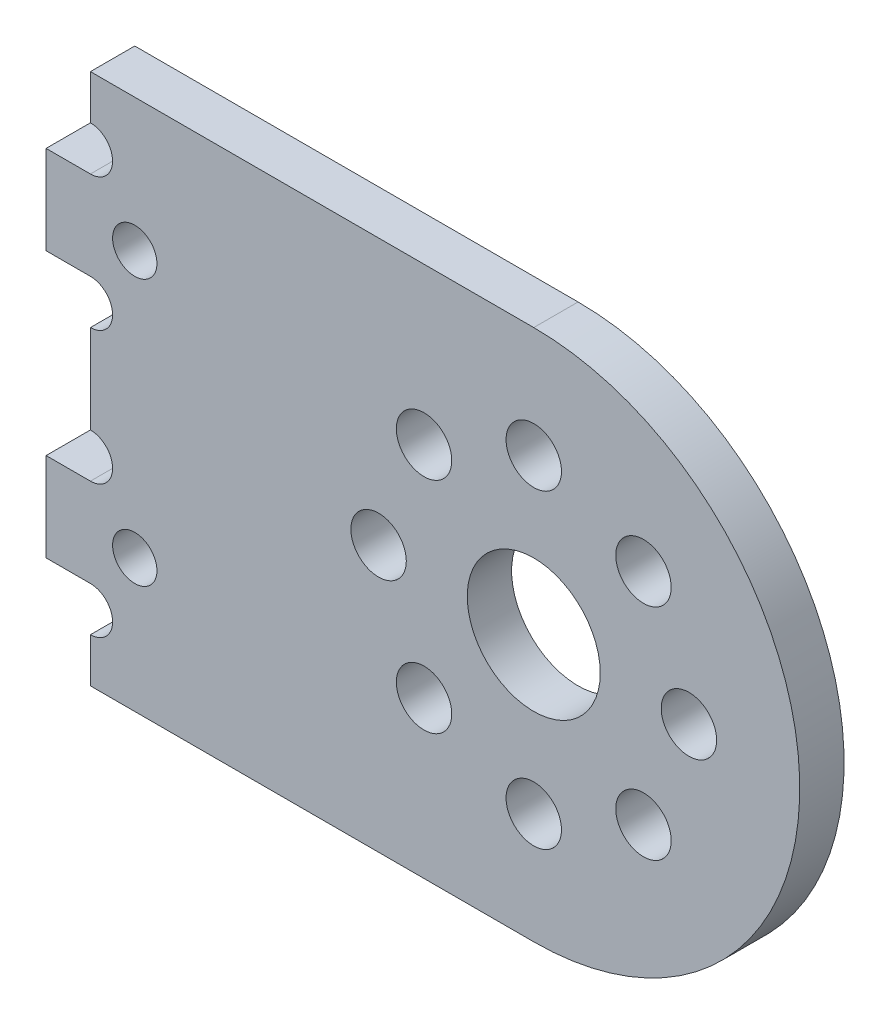
ISO-10303-21;
HEADER;
FILE_DESCRIPTION(('STEP AP214'),'2;1');
FILE_NAME('part.step','',(''),(''),'','','');
FILE_SCHEMA(('AUTOMOTIVE_DESIGN { 1 0 10303 214 1 1 1 1 }'));
ENDSEC;
DATA;
#1=APPLICATION_CONTEXT('core data for automotive mechanical design processes');
#2=APPLICATION_PROTOCOL_DEFINITION('international standard','automotive_design',2000,#1);
#3=PRODUCT_CONTEXT('',#1,'mechanical');
#4=PRODUCT('Part','Part','',(#3));
#5=PRODUCT_RELATED_PRODUCT_CATEGORY('part','',(#4));
#6=PRODUCT_DEFINITION_FORMATION('','',#4);
#7=PRODUCT_DEFINITION_CONTEXT('part definition',#1,'design');
#8=PRODUCT_DEFINITION('design','',#6,#7);
#9=PRODUCT_DEFINITION_SHAPE('','',#8);
#10=(LENGTH_UNIT() NAMED_UNIT(*) SI_UNIT(.MILLI.,.METRE.));
#11=(NAMED_UNIT(*) PLANE_ANGLE_UNIT() SI_UNIT($,.RADIAN.));
#12=(NAMED_UNIT(*) SI_UNIT($,.STERADIAN.) SOLID_ANGLE_UNIT());
#13=UNCERTAINTY_MEASURE_WITH_UNIT(LENGTH_MEASURE(1.E-05),#10,'distance_accuracy_value','');
#14=(GEOMETRIC_REPRESENTATION_CONTEXT(3) GLOBAL_UNCERTAINTY_ASSIGNED_CONTEXT((#13)) GLOBAL_UNIT_ASSIGNED_CONTEXT((#10,
#11,#12)) REPRESENTATION_CONTEXT('',''));
#15=CARTESIAN_POINT('',(0.,0.,0.));
#16=DIRECTION('',(0.,0.,1.));
#17=DIRECTION('',(1.,0.,0.));
#18=AXIS2_PLACEMENT_3D('',#15,#16,#17);
#19=CARTESIAN_POINT('',(-3.40478597967663,-0.138647311224838,2.));
#20=DIRECTION('',(0.,0.,-1.));
#21=DIRECTION('',(-1.,0.,0.));
#22=AXIS2_PLACEMENT_3D('',#19,#20,#21);
#23=PLANE('',#22);
#24=DIRECTION('',(-1.,0.,0.));
#25=VECTOR('',#24,1.);
#26=CARTESIAN_POINT('',(-23.4047859796766,11.8613526887752,2.));
#27=LINE('',#26,#25);
#28=CARTESIAN_POINT('',(-3.40478597967663,11.8613526887752,2.));
#29=VERTEX_POINT('',#28);
#30=CARTESIAN_POINT('',(-23.4047859796766,11.8613526887752,2.));
#31=VERTEX_POINT('',#30);
#32=EDGE_CURVE('E209',#29,#31,#27,.T.);
#33=ORIENTED_EDGE('',*,*,#32,.T.);
#34=DIRECTION('',(0.,-1.,0.));
#35=VECTOR('',#34,1.);
#36=CARTESIAN_POINT('',(-23.4047859796766,11.8613526887752,2.));
#37=LINE('',#36,#35);
#38=CARTESIAN_POINT('',(-23.4047859796766,9.86135268877516,2.));
#39=VERTEX_POINT('',#38);
#40=EDGE_CURVE('E117',#31,#39,#37,.T.);
#41=ORIENTED_EDGE('',*,*,#40,.T.);
#42=CARTESIAN_POINT('',(-23.4047859796766,8.86135268877516,2.));
#43=DIRECTION('',(0.,0.,-1.));
#44=DIRECTION('',(1.,0.,0.));
#45=AXIS2_PLACEMENT_3D('',#42,#43,#44);
#46=CIRCLE('',#45,1.);
#47=CARTESIAN_POINT('',(-23.4047859796766,7.86135268877516,2.));
#48=VERTEX_POINT('',#47);
#49=EDGE_CURVE('E248',#39,#48,#46,.T.);
#50=ORIENTED_EDGE('',*,*,#49,.T.);
#51=DIRECTION('',(-1.,0.,0.));
#52=VECTOR('',#51,1.);
#53=CARTESIAN_POINT('',(-23.4047859796766,7.86135268877516,2.));
#54=LINE('',#53,#52);
#55=CARTESIAN_POINT('',(-25.4047859796766,7.86135268877516,2.));
#56=VERTEX_POINT('',#55);
#57=EDGE_CURVE('E267',#48,#56,#54,.T.);
#58=ORIENTED_EDGE('',*,*,#57,.T.);
#59=DIRECTION('',(0.,-1.,0.));
#60=VECTOR('',#59,1.);
#61=CARTESIAN_POINT('',(-25.4047859796766,7.86135268877516,2.));
#62=LINE('',#61,#60);
#63=CARTESIAN_POINT('',(-25.4047859796766,3.86135268877516,2.));
#64=VERTEX_POINT('',#63);
#65=EDGE_CURVE('E264',#56,#64,#62,.T.);
#66=ORIENTED_EDGE('',*,*,#65,.T.);
#67=DIRECTION('',(1.,0.,0.));
#68=VECTOR('',#67,1.);
#69=CARTESIAN_POINT('',(-23.4047859796766,3.86135268877516,2.));
#70=LINE('',#69,#68);
#71=CARTESIAN_POINT('',(-23.4047859796766,3.86135268877516,2.));
#72=VERTEX_POINT('',#71);
#73=EDGE_CURVE('E266',#64,#72,#70,.T.);
#74=ORIENTED_EDGE('',*,*,#73,.T.);
#75=CARTESIAN_POINT('',(-23.4047859796766,2.86135268877516,2.));
#76=DIRECTION('',(0.,0.,-1.));
#77=DIRECTION('',(-1.,0.,0.));
#78=AXIS2_PLACEMENT_3D('',#75,#76,#77);
#79=CIRCLE('',#78,1.);
#80=CARTESIAN_POINT('',(-23.4047859796766,1.86135268877516,2.));
#81=VERTEX_POINT('',#80);
#82=EDGE_CURVE('E269',#72,#81,#79,.T.);
#83=ORIENTED_EDGE('',*,*,#82,.T.);
#84=DIRECTION('',(0.,-1.,0.));
#85=VECTOR('',#84,1.);
#86=CARTESIAN_POINT('',(-23.4047859796766,1.86135268877516,2.));
#87=LINE('',#86,#85);
#88=CARTESIAN_POINT('',(-23.4047859796766,-2.13864731122484,2.));
#89=VERTEX_POINT('',#88);
#90=EDGE_CURVE('E275',#81,#89,#87,.T.);
#91=ORIENTED_EDGE('',*,*,#90,.T.);
#92=CARTESIAN_POINT('',(-23.4047859796766,-3.13864731122484,2.));
#93=DIRECTION('',(0.,0.,-1.));
#94=DIRECTION('',(1.,0.,0.));
#95=AXIS2_PLACEMENT_3D('',#92,#93,#94);
#96=CIRCLE('',#95,1.);
#97=CARTESIAN_POINT('',(-23.4047859796766,-4.13864731122484,2.));
#98=VERTEX_POINT('',#97);
#99=EDGE_CURVE('E277',#89,#98,#96,.T.);
#100=ORIENTED_EDGE('',*,*,#99,.T.);
#101=DIRECTION('',(-1.,0.,0.));
#102=VECTOR('',#101,1.);
#103=CARTESIAN_POINT('',(-23.4047859796766,-4.13864731122484,2.));
#104=LINE('',#103,#102);
#105=CARTESIAN_POINT('',(-25.4047859796766,-4.13864731122484,2.));
#106=VERTEX_POINT('',#105);
#107=EDGE_CURVE('E279',#98,#106,#104,.T.);
#108=ORIENTED_EDGE('',*,*,#107,.T.);
#109=DIRECTION('',(0.,-1.,0.));
#110=VECTOR('',#109,1.);
#111=CARTESIAN_POINT('',(-25.4047859796766,-4.13864731122484,2.));
#112=LINE('',#111,#110);
#113=CARTESIAN_POINT('',(-25.4047859796766,-8.13864731122484,2.));
#114=VERTEX_POINT('',#113);
#115=EDGE_CURVE('E281',#106,#114,#112,.T.);
#116=ORIENTED_EDGE('',*,*,#115,.T.);
#117=DIRECTION('',(1.,0.,0.));
#118=VECTOR('',#117,1.);
#119=CARTESIAN_POINT('',(-23.4047859796766,-8.13864731122484,2.));
#120=LINE('',#119,#118);
#121=CARTESIAN_POINT('',(-23.4047859796766,-8.13864731122484,2.));
#122=VERTEX_POINT('',#121);
#123=EDGE_CURVE('E283',#114,#122,#120,.T.);
#124=ORIENTED_EDGE('',*,*,#123,.T.);
#125=CARTESIAN_POINT('',(-23.4047859796766,-9.13864731122484,2.));
#126=DIRECTION('',(0.,0.,-1.));
#127=DIRECTION('',(-1.,0.,0.));
#128=AXIS2_PLACEMENT_3D('',#125,#126,#127);
#129=CIRCLE('',#128,1.);
#130=CARTESIAN_POINT('',(-23.4047859796766,-10.1386473112248,2.));
#131=VERTEX_POINT('',#130);
#132=EDGE_CURVE('E160',#122,#131,#129,.T.);
#133=ORIENTED_EDGE('',*,*,#132,.T.);
#134=DIRECTION('',(0.,-1.,0.));
#135=VECTOR('',#134,1.);
#136=CARTESIAN_POINT('',(-23.4047859796766,-10.1386473112248,2.));
#137=LINE('',#136,#135);
#138=CARTESIAN_POINT('',(-23.4047859796766,-12.1386473112248,2.));
#139=VERTEX_POINT('',#138);
#140=EDGE_CURVE('E154',#131,#139,#137,.T.);
#141=ORIENTED_EDGE('',*,*,#140,.T.);
#142=DIRECTION('',(1.,0.,0.));
#143=VECTOR('',#142,1.);
#144=CARTESIAN_POINT('',(-3.40478597967662,-12.1386473112248,2.));
#145=LINE('',#144,#143);
#146=CARTESIAN_POINT('',(-3.40478597967662,-12.1386473112248,2.));
#147=VERTEX_POINT('',#146);
#148=EDGE_CURVE('E158',#139,#147,#145,.T.);
#149=ORIENTED_EDGE('',*,*,#148,.T.);
#150=CARTESIAN_POINT('',(-3.40478597967663,-0.138647311224838,2.));
#151=DIRECTION('',(0.,0.,1.));
#152=DIRECTION('',(-1.,0.,0.));
#153=AXIS2_PLACEMENT_3D('',#150,#151,#152);
#154=CIRCLE('',#153,12.);
#155=EDGE_CURVE('E50',#147,#29,#154,.T.);
#156=ORIENTED_EDGE('',*,*,#155,.T.);
#157=EDGE_LOOP('',(#33,#41,#50,#58,#66,#74,#83,#91,#100,#108,#116,#124,#133,#141,#149,#156));
#158=FACE_BOUND('',#157,.T.);
#159=CARTESIAN_POINT('',(-3.40478597967662,6.86135268877516,2.));
#160=DIRECTION('',(0.,0.,1.));
#161=DIRECTION('',(1.,0.,0.));
#162=AXIS2_PLACEMENT_3D('',#159,#160,#161);
#163=CIRCLE('',#162,1.25);
#164=CARTESIAN_POINT('',(-2.15478597967662,6.86135268877516,2.));
#165=VERTEX_POINT('',#164);
#166=EDGE_CURVE('E182',#165,#165,#163,.T.);
#167=ORIENTED_EDGE('',*,*,#166,.F.);
#168=EDGE_LOOP('',(#167));
#169=FACE_BOUND('',#168,.T.);
#170=CARTESIAN_POINT('',(1.54496148862924,4.81110015708106,2.));
#171=DIRECTION('',(0.,0.,1.));
#172=DIRECTION('',(1.,0.,0.));
#173=AXIS2_PLACEMENT_3D('',#170,#171,#172);
#174=CIRCLE('',#173,1.25);
#175=CARTESIAN_POINT('',(2.79496148862924,4.81110015708106,2.));
#176=VERTEX_POINT('',#175);
#177=EDGE_CURVE('E417',#176,#176,#174,.T.);
#178=ORIENTED_EDGE('',*,*,#177,.F.);
#179=EDGE_LOOP('',(#178));
#180=FACE_BOUND('',#179,.T.);
#181=CARTESIAN_POINT('',(-3.40478597967662,-0.13864731122484,2.));
#182=DIRECTION('',(0.,0.,1.));
#183=DIRECTION('',(1.,0.,0.));
#184=AXIS2_PLACEMENT_3D('',#181,#182,#183);
#185=CIRCLE('',#184,3.);
#186=CARTESIAN_POINT('',(-0.404785979676623,-0.13864731122484,2.));
#187=VERTEX_POINT('',#186);
#188=EDGE_CURVE('E411',#187,#187,#185,.T.);
#189=ORIENTED_EDGE('',*,*,#188,.F.);
#190=EDGE_LOOP('',(#189));
#191=FACE_BOUND('',#190,.T.);
#192=CARTESIAN_POINT('',(3.59521402032347,-0.138647311224741,2.));
#193=DIRECTION('',(0.,0.,1.));
#194=DIRECTION('',(1.,0.,0.));
#195=AXIS2_PLACEMENT_3D('',#192,#193,#194);
#196=CIRCLE('',#195,1.25);
#197=CARTESIAN_POINT('',(4.84521402032347,-0.138647311224741,2.));
#198=VERTEX_POINT('',#197);
#199=EDGE_CURVE('E405',#198,#198,#196,.T.);
#200=ORIENTED_EDGE('',*,*,#199,.F.);
#201=EDGE_LOOP('',(#200));
#202=FACE_BOUND('',#201,.T.);
#203=CARTESIAN_POINT('',(1.54496148862937,-5.0883947795306,2.));
#204=DIRECTION('',(0.,0.,1.));
#205=DIRECTION('',(1.,0.,0.));
#206=AXIS2_PLACEMENT_3D('',#203,#204,#205);
#207=CIRCLE('',#206,1.25);
#208=CARTESIAN_POINT('',(2.79496148862937,-5.0883947795306,2.));
#209=VERTEX_POINT('',#208);
#210=EDGE_CURVE('E399',#209,#209,#207,.T.);
#211=ORIENTED_EDGE('',*,*,#210,.F.);
#212=EDGE_LOOP('',(#211));
#213=FACE_BOUND('',#212,.T.);
#214=CARTESIAN_POINT('',(-3.40478597967643,-7.13864731122484,2.));
#215=DIRECTION('',(0.,0.,1.));
#216=DIRECTION('',(1.,0.,0.));
#217=AXIS2_PLACEMENT_3D('',#214,#215,#216);
#218=CIRCLE('',#217,1.25);
#219=CARTESIAN_POINT('',(-2.15478597967643,-7.13864731122484,2.));
#220=VERTEX_POINT('',#219);
#221=EDGE_CURVE('E393',#220,#220,#218,.T.);
#222=ORIENTED_EDGE('',*,*,#221,.F.);
#223=EDGE_LOOP('',(#222));
#224=FACE_BOUND('',#223,.T.);
#225=CARTESIAN_POINT('',(-8.35453344798229,-5.08839477953074,2.));
#226=DIRECTION('',(0.,0.,1.));
#227=DIRECTION('',(1.,0.,0.));
#228=AXIS2_PLACEMENT_3D('',#225,#226,#227);
#229=CIRCLE('',#228,1.25);
#230=CARTESIAN_POINT('',(-7.10453344798229,-5.08839477953074,2.));
#231=VERTEX_POINT('',#230);
#232=EDGE_CURVE('E387',#231,#231,#229,.T.);
#233=ORIENTED_EDGE('',*,*,#232,.F.);
#234=EDGE_LOOP('',(#233));
#235=FACE_BOUND('',#234,.T.);
#236=CARTESIAN_POINT('',(-10.4047859796765,-0.138647311224932,2.));
#237=DIRECTION('',(0.,0.,1.));
#238=DIRECTION('',(1.,0.,0.));
#239=AXIS2_PLACEMENT_3D('',#236,#237,#238);
#240=CIRCLE('',#239,1.25);
#241=CARTESIAN_POINT('',(-9.15478597967652,-0.138647311224932,2.));
#242=VERTEX_POINT('',#241);
#243=EDGE_CURVE('E381',#242,#242,#240,.T.);
#244=ORIENTED_EDGE('',*,*,#243,.F.);
#245=EDGE_LOOP('',(#244));
#246=FACE_BOUND('',#245,.T.);
#247=CARTESIAN_POINT('',(-8.35453344798242,4.81110015708093,2.));
#248=DIRECTION('',(0.,0.,1.));
#249=DIRECTION('',(1.,0.,0.));
#250=AXIS2_PLACEMENT_3D('',#247,#248,#249);
#251=CIRCLE('',#250,1.25);
#252=CARTESIAN_POINT('',(-7.10453344798242,4.81110015708093,2.));
#253=VERTEX_POINT('',#252);
#254=EDGE_CURVE('E375',#253,#253,#251,.T.);
#255=ORIENTED_EDGE('',*,*,#254,.F.);
#256=EDGE_LOOP('',(#255));
#257=FACE_BOUND('',#256,.T.);
#258=CARTESIAN_POINT('',(-21.4047859796766,5.86135268877516,2.));
#259=DIRECTION('',(0.,0.,1.));
#260=DIRECTION('',(1.,0.,0.));
#261=AXIS2_PLACEMENT_3D('',#258,#259,#260);
#262=CIRCLE('',#261,1.);
#263=CARTESIAN_POINT('',(-20.4047859796766,5.86135268877516,2.));
#264=VERTEX_POINT('',#263);
#265=EDGE_CURVE('E369',#264,#264,#262,.T.);
#266=ORIENTED_EDGE('',*,*,#265,.F.);
#267=EDGE_LOOP('',(#266));
#268=FACE_BOUND('',#267,.T.);
#269=CARTESIAN_POINT('',(-21.4047859796766,-6.13864731122484,2.));
#270=DIRECTION('',(0.,0.,1.));
#271=DIRECTION('',(1.,0.,0.));
#272=AXIS2_PLACEMENT_3D('',#269,#270,#271);
#273=CIRCLE('',#272,1.);
#274=CARTESIAN_POINT('',(-20.4047859796766,-6.13864731122484,2.));
#275=VERTEX_POINT('',#274);
#276=EDGE_CURVE('E360',#275,#275,#273,.T.);
#277=ORIENTED_EDGE('',*,*,#276,.F.);
#278=EDGE_LOOP('',(#277));
#279=FACE_BOUND('',#278,.T.);
#280=ADVANCED_FACE('F33',(#158,#169,#180,#191,#202,#213,#224,#235,#246,#257,#268,#279),#23,.F.);
#281=CARTESIAN_POINT('',(-3.40478597967663,-0.138647311224838,0.));
#282=DIRECTION('',(0.,0.,-1.));
#283=DIRECTION('',(-1.,0.,0.));
#284=AXIS2_PLACEMENT_3D('',#281,#282,#283);
#285=PLANE('',#284);
#286=CARTESIAN_POINT('',(-21.4047859796766,5.86135268877516,0.));
#287=DIRECTION('',(0.,0.,1.));
#288=DIRECTION('',(1.,0.,0.));
#289=AXIS2_PLACEMENT_3D('',#286,#287,#288);
#290=CIRCLE('',#289,1.);
#291=CARTESIAN_POINT('',(-20.4047859796766,5.86135268877516,0.));
#292=VERTEX_POINT('',#291);
#293=EDGE_CURVE('E366',#292,#292,#290,.T.);
#294=ORIENTED_EDGE('',*,*,#293,.T.);
#295=EDGE_LOOP('',(#294));
#296=FACE_BOUND('',#295,.T.);
#297=CARTESIAN_POINT('',(-10.4047859796765,-0.138647311224932,0.));
#298=DIRECTION('',(0.,0.,1.));
#299=DIRECTION('',(1.,0.,0.));
#300=AXIS2_PLACEMENT_3D('',#297,#298,#299);
#301=CIRCLE('',#300,1.25);
#302=CARTESIAN_POINT('',(-9.15478597967652,-0.138647311224932,0.));
#303=VERTEX_POINT('',#302);
#304=EDGE_CURVE('E378',#303,#303,#301,.T.);
#305=ORIENTED_EDGE('',*,*,#304,.T.);
#306=EDGE_LOOP('',(#305));
#307=FACE_BOUND('',#306,.T.);
#308=CARTESIAN_POINT('',(-3.40478597967643,-7.13864731122484,0.));
#309=DIRECTION('',(0.,0.,1.));
#310=DIRECTION('',(1.,0.,0.));
#311=AXIS2_PLACEMENT_3D('',#308,#309,#310);
#312=CIRCLE('',#311,1.25);
#313=CARTESIAN_POINT('',(-2.15478597967643,-7.13864731122484,0.));
#314=VERTEX_POINT('',#313);
#315=EDGE_CURVE('E390',#314,#314,#312,.T.);
#316=ORIENTED_EDGE('',*,*,#315,.T.);
#317=EDGE_LOOP('',(#316));
#318=FACE_BOUND('',#317,.T.);
#319=CARTESIAN_POINT('',(3.59521402032347,-0.138647311224741,0.));
#320=DIRECTION('',(0.,0.,1.));
#321=DIRECTION('',(1.,0.,0.));
#322=AXIS2_PLACEMENT_3D('',#319,#320,#321);
#323=CIRCLE('',#322,1.25);
#324=CARTESIAN_POINT('',(4.84521402032347,-0.138647311224741,0.));
#325=VERTEX_POINT('',#324);
#326=EDGE_CURVE('E402',#325,#325,#323,.T.);
#327=ORIENTED_EDGE('',*,*,#326,.T.);
#328=EDGE_LOOP('',(#327));
#329=FACE_BOUND('',#328,.T.);
#330=CARTESIAN_POINT('',(1.54496148862924,4.81110015708106,0.));
#331=DIRECTION('',(0.,0.,1.));
#332=DIRECTION('',(1.,0.,0.));
#333=AXIS2_PLACEMENT_3D('',#330,#331,#332);
#334=CIRCLE('',#333,1.25);
#335=CARTESIAN_POINT('',(2.79496148862924,4.81110015708106,0.));
#336=VERTEX_POINT('',#335);
#337=EDGE_CURVE('E414',#336,#336,#334,.T.);
#338=ORIENTED_EDGE('',*,*,#337,.T.);
#339=EDGE_LOOP('',(#338));
#340=FACE_BOUND('',#339,.T.);
#341=DIRECTION('',(-1.,0.,0.));
#342=VECTOR('',#341,1.);
#343=CARTESIAN_POINT('',(-23.4047859796766,11.8613526887752,0.));
#344=LINE('',#343,#342);
#345=CARTESIAN_POINT('',(-3.40478597967663,11.8613526887752,0.));
#346=VERTEX_POINT('',#345);
#347=CARTESIAN_POINT('',(-23.4047859796766,11.8613526887752,0.));
#348=VERTEX_POINT('',#347);
#349=EDGE_CURVE('E178',#346,#348,#344,.T.);
#350=ORIENTED_EDGE('',*,*,#349,.F.);
#351=CARTESIAN_POINT('',(-3.40478597967663,-0.138647311224838,0.));
#352=DIRECTION('',(0.,0.,1.));
#353=DIRECTION('',(-1.,0.,0.));
#354=AXIS2_PLACEMENT_3D('',#351,#352,#353);
#355=CIRCLE('',#354,12.);
#356=CARTESIAN_POINT('',(-3.40478597967662,-12.1386473112248,0.));
#357=VERTEX_POINT('',#356);
#358=EDGE_CURVE('E109',#357,#346,#355,.T.);
#359=ORIENTED_EDGE('',*,*,#358,.F.);
#360=DIRECTION('',(1.,0.,0.));
#361=VECTOR('',#360,1.);
#362=CARTESIAN_POINT('',(-3.40478597967662,-12.1386473112248,0.));
#363=LINE('',#362,#361);
#364=CARTESIAN_POINT('',(-23.4047859796766,-12.1386473112248,0.));
#365=VERTEX_POINT('',#364);
#366=EDGE_CURVE('E103',#365,#357,#363,.T.);
#367=ORIENTED_EDGE('',*,*,#366,.F.);
#368=DIRECTION('',(0.,-1.,0.));
#369=VECTOR('',#368,1.);
#370=CARTESIAN_POINT('',(-23.4047859796766,-10.1386473112248,0.));
#371=LINE('',#370,#369);
#372=CARTESIAN_POINT('',(-23.4047859796766,-10.1386473112248,0.));
#373=VERTEX_POINT('',#372);
#374=EDGE_CURVE('E168',#373,#365,#371,.T.);
#375=ORIENTED_EDGE('',*,*,#374,.F.);
#376=CARTESIAN_POINT('',(-23.4047859796766,-9.13864731122484,0.));
#377=DIRECTION('',(0.,0.,-1.));
#378=DIRECTION('',(-1.,0.,0.));
#379=AXIS2_PLACEMENT_3D('',#376,#377,#378);
#380=CIRCLE('',#379,1.);
#381=CARTESIAN_POINT('',(-23.4047859796766,-8.13864731122484,0.));
#382=VERTEX_POINT('',#381);
#383=EDGE_CURVE('E204',#382,#373,#380,.T.);
#384=ORIENTED_EDGE('',*,*,#383,.F.);
#385=DIRECTION('',(1.,0.,0.));
#386=VECTOR('',#385,1.);
#387=CARTESIAN_POINT('',(-23.4047859796766,-8.13864731122484,0.));
#388=LINE('',#387,#386);
#389=CARTESIAN_POINT('',(-25.4047859796766,-8.13864731122484,0.));
#390=VERTEX_POINT('',#389);
#391=EDGE_CURVE('E202',#390,#382,#388,.T.);
#392=ORIENTED_EDGE('',*,*,#391,.F.);
#393=DIRECTION('',(0.,-1.,0.));
#394=VECTOR('',#393,1.);
#395=CARTESIAN_POINT('',(-25.4047859796766,-4.13864731122484,0.));
#396=LINE('',#395,#394);
#397=CARTESIAN_POINT('',(-25.4047859796766,-4.13864731122484,0.));
#398=VERTEX_POINT('',#397);
#399=EDGE_CURVE('E200',#398,#390,#396,.T.);
#400=ORIENTED_EDGE('',*,*,#399,.F.);
#401=DIRECTION('',(-1.,0.,0.));
#402=VECTOR('',#401,1.);
#403=CARTESIAN_POINT('',(-23.4047859796766,-4.13864731122484,0.));
#404=LINE('',#403,#402);
#405=CARTESIAN_POINT('',(-23.4047859796766,-4.13864731122484,0.));
#406=VERTEX_POINT('',#405);
#407=EDGE_CURVE('E198',#406,#398,#404,.T.);
#408=ORIENTED_EDGE('',*,*,#407,.F.);
#409=CARTESIAN_POINT('',(-23.4047859796766,-3.13864731122484,0.));
#410=DIRECTION('',(0.,0.,-1.));
#411=DIRECTION('',(1.,0.,0.));
#412=AXIS2_PLACEMENT_3D('',#409,#410,#411);
#413=CIRCLE('',#412,1.);
#414=CARTESIAN_POINT('',(-23.4047859796766,-2.13864731122484,0.));
#415=VERTEX_POINT('',#414);
#416=EDGE_CURVE('E196',#415,#406,#413,.T.);
#417=ORIENTED_EDGE('',*,*,#416,.F.);
#418=DIRECTION('',(0.,-1.,0.));
#419=VECTOR('',#418,1.);
#420=CARTESIAN_POINT('',(-23.4047859796766,1.86135268877516,0.));
#421=LINE('',#420,#419);
#422=CARTESIAN_POINT('',(-23.4047859796766,1.86135268877516,0.));
#423=VERTEX_POINT('',#422);
#424=EDGE_CURVE('E194',#423,#415,#421,.T.);
#425=ORIENTED_EDGE('',*,*,#424,.F.);
#426=CARTESIAN_POINT('',(-23.4047859796766,2.86135268877516,0.));
#427=DIRECTION('',(0.,0.,-1.));
#428=DIRECTION('',(-1.,0.,0.));
#429=AXIS2_PLACEMENT_3D('',#426,#427,#428);
#430=CIRCLE('',#429,1.);
#431=CARTESIAN_POINT('',(-23.4047859796766,3.86135268877516,0.));
#432=VERTEX_POINT('',#431);
#433=EDGE_CURVE('E192',#432,#423,#430,.T.);
#434=ORIENTED_EDGE('',*,*,#433,.F.);
#435=DIRECTION('',(1.,0.,0.));
#436=VECTOR('',#435,1.);
#437=CARTESIAN_POINT('',(-23.4047859796766,3.86135268877516,0.));
#438=LINE('',#437,#436);
#439=CARTESIAN_POINT('',(-25.4047859796766,3.86135268877516,0.));
#440=VERTEX_POINT('',#439);
#441=EDGE_CURVE('E190',#440,#432,#438,.T.);
#442=ORIENTED_EDGE('',*,*,#441,.F.);
#443=DIRECTION('',(0.,-1.,0.));
#444=VECTOR('',#443,1.);
#445=CARTESIAN_POINT('',(-25.4047859796766,7.86135268877516,0.));
#446=LINE('',#445,#444);
#447=CARTESIAN_POINT('',(-25.4047859796766,7.86135268877516,0.));
#448=VERTEX_POINT('',#447);
#449=EDGE_CURVE('E188',#448,#440,#446,.T.);
#450=ORIENTED_EDGE('',*,*,#449,.F.);
#451=DIRECTION('',(-1.,0.,0.));
#452=VECTOR('',#451,1.);
#453=CARTESIAN_POINT('',(-23.4047859796766,7.86135268877516,0.));
#454=LINE('',#453,#452);
#455=CARTESIAN_POINT('',(-23.4047859796766,7.86135268877516,0.));
#456=VERTEX_POINT('',#455);
#457=EDGE_CURVE('E186',#456,#448,#454,.T.);
#458=ORIENTED_EDGE('',*,*,#457,.F.);
#459=CARTESIAN_POINT('',(-23.4047859796766,8.86135268877516,0.));
#460=DIRECTION('',(0.,0.,-1.));
#461=DIRECTION('',(1.,0.,0.));
#462=AXIS2_PLACEMENT_3D('',#459,#460,#461);
#463=CIRCLE('',#462,1.);
#464=CARTESIAN_POINT('',(-23.4047859796766,9.86135268877516,0.));
#465=VERTEX_POINT('',#464);
#466=EDGE_CURVE('E184',#465,#456,#463,.T.);
#467=ORIENTED_EDGE('',*,*,#466,.F.);
#468=DIRECTION('',(0.,-1.,0.));
#469=VECTOR('',#468,1.);
#470=CARTESIAN_POINT('',(-23.4047859796766,11.8613526887752,0.));
#471=LINE('',#470,#469);
#472=EDGE_CURVE('E181',#348,#465,#471,.T.);
#473=ORIENTED_EDGE('',*,*,#472,.F.);
#474=EDGE_LOOP('',(#350,#359,#367,#375,#384,#392,#400,#408,#417,#425,#434,#442,#450,#458,#467,#473));
#475=FACE_BOUND('',#474,.T.);
#476=CARTESIAN_POINT('',(-3.40478597967662,6.86135268877516,0.));
#477=DIRECTION('',(0.,0.,1.));
#478=DIRECTION('',(1.,0.,0.));
#479=AXIS2_PLACEMENT_3D('',#476,#477,#478);
#480=CIRCLE('',#479,1.25);
#481=CARTESIAN_POINT('',(-2.15478597967662,6.86135268877516,0.));
#482=VERTEX_POINT('',#481);
#483=EDGE_CURVE('E420',#482,#482,#480,.T.);
#484=ORIENTED_EDGE('',*,*,#483,.T.);
#485=EDGE_LOOP('',(#484));
#486=FACE_BOUND('',#485,.T.);
#487=CARTESIAN_POINT('',(-3.40478597967662,-0.13864731122484,0.));
#488=DIRECTION('',(0.,0.,1.));
#489=DIRECTION('',(1.,0.,0.));
#490=AXIS2_PLACEMENT_3D('',#487,#488,#489);
#491=CIRCLE('',#490,3.);
#492=CARTESIAN_POINT('',(-0.404785979676623,-0.13864731122484,0.));
#493=VERTEX_POINT('',#492);
#494=EDGE_CURVE('E408',#493,#493,#491,.T.);
#495=ORIENTED_EDGE('',*,*,#494,.T.);
#496=EDGE_LOOP('',(#495));
#497=FACE_BOUND('',#496,.T.);
#498=CARTESIAN_POINT('',(1.54496148862937,-5.0883947795306,0.));
#499=DIRECTION('',(0.,0.,1.));
#500=DIRECTION('',(1.,0.,0.));
#501=AXIS2_PLACEMENT_3D('',#498,#499,#500);
#502=CIRCLE('',#501,1.25);
#503=CARTESIAN_POINT('',(2.79496148862937,-5.0883947795306,0.));
#504=VERTEX_POINT('',#503);
#505=EDGE_CURVE('E396',#504,#504,#502,.T.);
#506=ORIENTED_EDGE('',*,*,#505,.T.);
#507=EDGE_LOOP('',(#506));
#508=FACE_BOUND('',#507,.T.);
#509=CARTESIAN_POINT('',(-8.35453344798229,-5.08839477953074,0.));
#510=DIRECTION('',(0.,0.,1.));
#511=DIRECTION('',(1.,0.,0.));
#512=AXIS2_PLACEMENT_3D('',#509,#510,#511);
#513=CIRCLE('',#512,1.25);
#514=CARTESIAN_POINT('',(-7.10453344798229,-5.08839477953074,0.));
#515=VERTEX_POINT('',#514);
#516=EDGE_CURVE('E384',#515,#515,#513,.T.);
#517=ORIENTED_EDGE('',*,*,#516,.T.);
#518=EDGE_LOOP('',(#517));
#519=FACE_BOUND('',#518,.T.);
#520=CARTESIAN_POINT('',(-8.35453344798242,4.81110015708093,0.));
#521=DIRECTION('',(0.,0.,1.));
#522=DIRECTION('',(1.,0.,0.));
#523=AXIS2_PLACEMENT_3D('',#520,#521,#522);
#524=CIRCLE('',#523,1.25);
#525=CARTESIAN_POINT('',(-7.10453344798242,4.81110015708093,0.));
#526=VERTEX_POINT('',#525);
#527=EDGE_CURVE('E372',#526,#526,#524,.T.);
#528=ORIENTED_EDGE('',*,*,#527,.T.);
#529=EDGE_LOOP('',(#528));
#530=FACE_BOUND('',#529,.T.);
#531=CARTESIAN_POINT('',(-21.4047859796766,-6.13864731122484,0.));
#532=DIRECTION('',(0.,0.,1.));
#533=DIRECTION('',(1.,0.,0.));
#534=AXIS2_PLACEMENT_3D('',#531,#532,#533);
#535=CIRCLE('',#534,1.);
#536=CARTESIAN_POINT('',(-20.4047859796766,-6.13864731122484,0.));
#537=VERTEX_POINT('',#536);
#538=EDGE_CURVE('E363',#537,#537,#535,.T.);
#539=ORIENTED_EDGE('',*,*,#538,.T.);
#540=EDGE_LOOP('',(#539));
#541=FACE_BOUND('',#540,.T.);
#542=ADVANCED_FACE('F252',(#296,#307,#318,#329,#340,#475,#486,#497,#508,#519,#530,#541),#285,.T.);
#543=CARTESIAN_POINT('',(-23.4047859796766,11.8613526887752,2.));
#544=DIRECTION('',(0.,-1.,0.));
#545=DIRECTION('',(0.,0.,-1.));
#546=AXIS2_PLACEMENT_3D('',#543,#544,#545);
#547=PLANE('',#546);
#548=ORIENTED_EDGE('',*,*,#349,.T.);
#549=DIRECTION('',(0.,0.,-1.));
#550=VECTOR('',#549,1.);
#551=CARTESIAN_POINT('',(-23.4047859796766,11.8613526887752,2.));
#552=LINE('',#551,#550);
#553=EDGE_CURVE('E11',#31,#348,#552,.T.);
#554=ORIENTED_EDGE('',*,*,#553,.F.);
#555=ORIENTED_EDGE('',*,*,#32,.F.);
#556=DIRECTION('',(0.,0.,-1.));
#557=VECTOR('',#556,1.);
#558=CARTESIAN_POINT('',(-3.40478597967663,11.8613526887752,2.));
#559=LINE('',#558,#557);
#560=EDGE_CURVE('E174',#29,#346,#559,.T.);
#561=ORIENTED_EDGE('',*,*,#560,.T.);
#562=EDGE_LOOP('',(#548,#554,#555,#561));
#563=FACE_BOUND('',#562,.T.);
#564=ADVANCED_FACE('F35',(#563),#547,.F.);
#565=CARTESIAN_POINT('',(-23.4047859796766,11.8613526887752,2.));
#566=DIRECTION('',(1.,0.,0.));
#567=DIRECTION('',(0.,1.,0.));
#568=AXIS2_PLACEMENT_3D('',#565,#566,#567);
#569=PLANE('',#568);
#570=ORIENTED_EDGE('',*,*,#472,.T.);
#571=DIRECTION('',(0.,0.,-1.));
#572=VECTOR('',#571,1.);
#573=CARTESIAN_POINT('',(-23.4047859796766,9.86135268877516,2.));
#574=LINE('',#573,#572);
#575=EDGE_CURVE('E42',#39,#465,#574,.T.);
#576=ORIENTED_EDGE('',*,*,#575,.F.);
#577=ORIENTED_EDGE('',*,*,#40,.F.);
#578=ORIENTED_EDGE('',*,*,#553,.T.);
#579=EDGE_LOOP('',(#570,#576,#577,#578));
#580=FACE_BOUND('',#579,.T.);
#581=ADVANCED_FACE('F635',(#580),#569,.F.);
#582=CARTESIAN_POINT('',(-23.4047859796766,8.86135268877516,2.));
#583=DIRECTION('',(0.,0.,-1.));
#584=DIRECTION('',(-1.,0.,0.));
#585=AXIS2_PLACEMENT_3D('',#582,#583,#584);
#586=CYLINDRICAL_SURFACE('',#585,1.);
#587=ORIENTED_EDGE('',*,*,#466,.T.);
#588=DIRECTION('',(0.,0.,-1.));
#589=VECTOR('',#588,1.);
#590=CARTESIAN_POINT('',(-23.4047859796766,7.86135268877516,2.));
#591=LINE('',#590,#589);
#592=EDGE_CURVE('E240',#48,#456,#591,.T.);
#593=ORIENTED_EDGE('',*,*,#592,.F.);
#594=ORIENTED_EDGE('',*,*,#49,.F.);
#595=ORIENTED_EDGE('',*,*,#575,.T.);
#596=EDGE_LOOP('',(#587,#593,#594,#595));
#597=FACE_BOUND('',#596,.T.);
#598=ADVANCED_FACE('F246',(#597),#586,.F.);
#599=CARTESIAN_POINT('',(-23.4047859796766,7.86135268877516,2.));
#600=DIRECTION('',(0.,-1.,0.));
#601=DIRECTION('',(1.,0.,0.));
#602=AXIS2_PLACEMENT_3D('',#599,#600,#601);
#603=PLANE('',#602);
#604=ORIENTED_EDGE('',*,*,#457,.T.);
#605=DIRECTION('',(0.,0.,-1.));
#606=VECTOR('',#605,1.);
#607=CARTESIAN_POINT('',(-25.4047859796766,7.86135268877516,2.));
#608=LINE('',#607,#606);
#609=EDGE_CURVE('E237',#56,#448,#608,.T.);
#610=ORIENTED_EDGE('',*,*,#609,.F.);
#611=ORIENTED_EDGE('',*,*,#57,.F.);
#612=ORIENTED_EDGE('',*,*,#592,.T.);
#613=EDGE_LOOP('',(#604,#610,#611,#612));
#614=FACE_BOUND('',#613,.T.);
#615=ADVANCED_FACE('F258',(#614),#603,.F.);
#616=CARTESIAN_POINT('',(-25.4047859796766,7.86135268877516,2.));
#617=DIRECTION('',(1.,0.,0.));
#618=DIRECTION('',(0.,0.,-1.));
#619=AXIS2_PLACEMENT_3D('',#616,#617,#618);
#620=PLANE('',#619);
#621=ORIENTED_EDGE('',*,*,#449,.T.);
#622=DIRECTION('',(0.,0.,-1.));
#623=VECTOR('',#622,1.);
#624=CARTESIAN_POINT('',(-25.4047859796766,3.86135268877516,2.));
#625=LINE('',#624,#623);
#626=EDGE_CURVE('E234',#64,#440,#625,.T.);
#627=ORIENTED_EDGE('',*,*,#626,.F.);
#628=ORIENTED_EDGE('',*,*,#65,.F.);
#629=ORIENTED_EDGE('',*,*,#609,.T.);
#630=EDGE_LOOP('',(#621,#627,#628,#629));
#631=FACE_BOUND('',#630,.T.);
#632=ADVANCED_FACE('F262',(#631),#620,.F.);
#633=CARTESIAN_POINT('',(-23.4047859796766,3.86135268877516,2.));
#634=DIRECTION('',(0.,1.,0.));
#635=DIRECTION('',(0.,0.,1.));
#636=AXIS2_PLACEMENT_3D('',#633,#634,#635);
#637=PLANE('',#636);
#638=ORIENTED_EDGE('',*,*,#441,.T.);
#639=DIRECTION('',(0.,0.,-1.));
#640=VECTOR('',#639,1.);
#641=CARTESIAN_POINT('',(-23.4047859796766,3.86135268877516,2.));
#642=LINE('',#641,#640);
#643=EDGE_CURVE('E231',#72,#432,#642,.T.);
#644=ORIENTED_EDGE('',*,*,#643,.F.);
#645=ORIENTED_EDGE('',*,*,#73,.F.);
#646=ORIENTED_EDGE('',*,*,#626,.T.);
#647=EDGE_LOOP('',(#638,#644,#645,#646));
#648=FACE_BOUND('',#647,.T.);
#649=ADVANCED_FACE('F600',(#648),#637,.F.);
#650=CARTESIAN_POINT('',(-23.4047859796766,2.86135268877516,2.));
#651=DIRECTION('',(0.,0.,-1.));
#652=DIRECTION('',(-1.,0.,0.));
#653=AXIS2_PLACEMENT_3D('',#650,#651,#652);
#654=CYLINDRICAL_SURFACE('',#653,1.);
#655=ORIENTED_EDGE('',*,*,#433,.T.);
#656=DIRECTION('',(0.,0.,-1.));
#657=VECTOR('',#656,1.);
#658=CARTESIAN_POINT('',(-23.4047859796766,1.86135268877516,2.));
#659=LINE('',#658,#657);
#660=EDGE_CURVE('E228',#81,#423,#659,.T.);
#661=ORIENTED_EDGE('',*,*,#660,.F.);
#662=ORIENTED_EDGE('',*,*,#82,.F.);
#663=ORIENTED_EDGE('',*,*,#643,.T.);
#664=EDGE_LOOP('',(#655,#661,#662,#663));
#665=FACE_BOUND('',#664,.T.);
#666=ADVANCED_FACE('F590',(#665),#654,.F.);
#667=CARTESIAN_POINT('',(-23.4047859796766,1.86135268877516,2.));
#668=DIRECTION('',(1.,0.,0.));
#669=DIRECTION('',(0.,1.,0.));
#670=AXIS2_PLACEMENT_3D('',#667,#668,#669);
#671=PLANE('',#670);
#672=ORIENTED_EDGE('',*,*,#424,.T.);
#673=DIRECTION('',(0.,0.,-1.));
#674=VECTOR('',#673,1.);
#675=CARTESIAN_POINT('',(-23.4047859796766,-2.13864731122484,2.));
#676=LINE('',#675,#674);
#677=EDGE_CURVE('E225',#89,#415,#676,.T.);
#678=ORIENTED_EDGE('',*,*,#677,.F.);
#679=ORIENTED_EDGE('',*,*,#90,.F.);
#680=ORIENTED_EDGE('',*,*,#660,.T.);
#681=EDGE_LOOP('',(#672,#678,#679,#680));
#682=FACE_BOUND('',#681,.T.);
#683=ADVANCED_FACE('F580',(#682),#671,.F.);
#684=CARTESIAN_POINT('',(-23.4047859796766,-3.13864731122484,2.));
#685=DIRECTION('',(0.,0.,-1.));
#686=DIRECTION('',(-1.,0.,0.));
#687=AXIS2_PLACEMENT_3D('',#684,#685,#686);
#688=CYLINDRICAL_SURFACE('',#687,1.);
#689=ORIENTED_EDGE('',*,*,#416,.T.);
#690=DIRECTION('',(0.,0.,-1.));
#691=VECTOR('',#690,1.);
#692=CARTESIAN_POINT('',(-23.4047859796766,-4.13864731122484,2.));
#693=LINE('',#692,#691);
#694=EDGE_CURVE('E222',#98,#406,#693,.T.);
#695=ORIENTED_EDGE('',*,*,#694,.F.);
#696=ORIENTED_EDGE('',*,*,#99,.F.);
#697=ORIENTED_EDGE('',*,*,#677,.T.);
#698=EDGE_LOOP('',(#689,#695,#696,#697));
#699=FACE_BOUND('',#698,.T.);
#700=ADVANCED_FACE('F570',(#699),#688,.F.);
#701=CARTESIAN_POINT('',(-23.4047859796766,-4.13864731122484,2.));
#702=DIRECTION('',(0.,-1.,0.));
#703=DIRECTION('',(0.,0.,-1.));
#704=AXIS2_PLACEMENT_3D('',#701,#702,#703);
#705=PLANE('',#704);
#706=ORIENTED_EDGE('',*,*,#407,.T.);
#707=DIRECTION('',(0.,0.,-1.));
#708=VECTOR('',#707,1.);
#709=CARTESIAN_POINT('',(-25.4047859796766,-4.13864731122484,2.));
#710=LINE('',#709,#708);
#711=EDGE_CURVE('E219',#106,#398,#710,.T.);
#712=ORIENTED_EDGE('',*,*,#711,.F.);
#713=ORIENTED_EDGE('',*,*,#107,.F.);
#714=ORIENTED_EDGE('',*,*,#694,.T.);
#715=EDGE_LOOP('',(#706,#712,#713,#714));
#716=FACE_BOUND('',#715,.T.);
#717=ADVANCED_FACE('F560',(#716),#705,.F.);
#718=CARTESIAN_POINT('',(-25.4047859796766,-4.13864731122484,2.));
#719=DIRECTION('',(1.,0.,0.));
#720=DIRECTION('',(0.,0.,-1.));
#721=AXIS2_PLACEMENT_3D('',#718,#719,#720);
#722=PLANE('',#721);
#723=ORIENTED_EDGE('',*,*,#399,.T.);
#724=DIRECTION('',(0.,0.,-1.));
#725=VECTOR('',#724,1.);
#726=CARTESIAN_POINT('',(-25.4047859796766,-8.13864731122484,2.));
#727=LINE('',#726,#725);
#728=EDGE_CURVE('E216',#114,#390,#727,.T.);
#729=ORIENTED_EDGE('',*,*,#728,.F.);
#730=ORIENTED_EDGE('',*,*,#115,.F.);
#731=ORIENTED_EDGE('',*,*,#711,.T.);
#732=EDGE_LOOP('',(#723,#729,#730,#731));
#733=FACE_BOUND('',#732,.T.);
#734=ADVANCED_FACE('F551',(#733),#722,.F.);
#735=CARTESIAN_POINT('',(-23.4047859796766,-8.13864731122484,2.));
#736=DIRECTION('',(0.,1.,0.));
#737=DIRECTION('',(0.,0.,1.));
#738=AXIS2_PLACEMENT_3D('',#735,#736,#737);
#739=PLANE('',#738);
#740=ORIENTED_EDGE('',*,*,#391,.T.);
#741=DIRECTION('',(0.,0.,-1.));
#742=VECTOR('',#741,1.);
#743=CARTESIAN_POINT('',(-23.4047859796766,-8.13864731122484,2.));
#744=LINE('',#743,#742);
#745=EDGE_CURVE('E213',#122,#382,#744,.T.);
#746=ORIENTED_EDGE('',*,*,#745,.F.);
#747=ORIENTED_EDGE('',*,*,#123,.F.);
#748=ORIENTED_EDGE('',*,*,#728,.T.);
#749=EDGE_LOOP('',(#740,#746,#747,#748));
#750=FACE_BOUND('',#749,.T.);
#751=ADVANCED_FACE('F289',(#750),#739,.F.);
#752=CARTESIAN_POINT('',(-23.4047859796766,-9.13864731122484,2.));
#753=DIRECTION('',(0.,0.,-1.));
#754=DIRECTION('',(-1.,0.,0.));
#755=AXIS2_PLACEMENT_3D('',#752,#753,#754);
#756=CYLINDRICAL_SURFACE('',#755,1.);
#757=ORIENTED_EDGE('',*,*,#383,.T.);
#758=DIRECTION('',(0.,0.,-1.));
#759=VECTOR('',#758,1.);
#760=CARTESIAN_POINT('',(-23.4047859796766,-10.1386473112248,2.));
#761=LINE('',#760,#759);
#762=EDGE_CURVE('E169',#131,#373,#761,.T.);
#763=ORIENTED_EDGE('',*,*,#762,.F.);
#764=ORIENTED_EDGE('',*,*,#132,.F.);
#765=ORIENTED_EDGE('',*,*,#745,.T.);
#766=EDGE_LOOP('',(#757,#763,#764,#765));
#767=FACE_BOUND('',#766,.T.);
#768=ADVANCED_FACE('F293',(#767),#756,.F.);
#769=CARTESIAN_POINT('',(-23.4047859796766,-10.1386473112248,2.));
#770=DIRECTION('',(1.,0.,0.));
#771=DIRECTION('',(0.,1.,0.));
#772=AXIS2_PLACEMENT_3D('',#769,#770,#771);
#773=PLANE('',#772);
#774=ORIENTED_EDGE('',*,*,#374,.T.);
#775=DIRECTION('',(0.,0.,-1.));
#776=VECTOR('',#775,1.);
#777=CARTESIAN_POINT('',(-23.4047859796766,-12.1386473112248,2.));
#778=LINE('',#777,#776);
#779=EDGE_CURVE('E165',#139,#365,#778,.T.);
#780=ORIENTED_EDGE('',*,*,#779,.F.);
#781=ORIENTED_EDGE('',*,*,#140,.F.);
#782=ORIENTED_EDGE('',*,*,#762,.T.);
#783=EDGE_LOOP('',(#774,#780,#781,#782));
#784=FACE_BOUND('',#783,.T.);
#785=ADVANCED_FACE('F166',(#784),#773,.F.);
#786=CARTESIAN_POINT('',(-3.40478597967662,-12.1386473112248,2.));
#787=DIRECTION('',(0.,1.,0.));
#788=DIRECTION('',(-1.,0.,0.));
#789=AXIS2_PLACEMENT_3D('',#786,#787,#788);
#790=PLANE('',#789);
#791=ORIENTED_EDGE('',*,*,#366,.T.);
#792=DIRECTION('',(0.,0.,-1.));
#793=VECTOR('',#792,1.);
#794=CARTESIAN_POINT('',(-3.40478597967662,-12.1386473112248,2.));
#795=LINE('',#794,#793);
#796=EDGE_CURVE('E170',#147,#357,#795,.T.);
#797=ORIENTED_EDGE('',*,*,#796,.F.);
#798=ORIENTED_EDGE('',*,*,#148,.F.);
#799=ORIENTED_EDGE('',*,*,#779,.T.);
#800=EDGE_LOOP('',(#791,#797,#798,#799));
#801=FACE_BOUND('',#800,.T.);
#802=ADVANCED_FACE('F172',(#801),#790,.F.);
#803=CARTESIAN_POINT('',(-3.40478597967663,-0.138647311224838,2.));
#804=DIRECTION('',(0.,0.,-1.));
#805=DIRECTION('',(-1.,0.,0.));
#806=AXIS2_PLACEMENT_3D('',#803,#804,#805);
#807=CYLINDRICAL_SURFACE('',#806,12.);
#808=ORIENTED_EDGE('',*,*,#358,.T.);
#809=ORIENTED_EDGE('',*,*,#560,.F.);
#810=ORIENTED_EDGE('',*,*,#155,.F.);
#811=ORIENTED_EDGE('',*,*,#796,.T.);
#812=EDGE_LOOP('',(#808,#809,#810,#811));
#813=FACE_BOUND('',#812,.T.);
#814=ADVANCED_FACE('F297',(#813),#807,.T.);
#815=CARTESIAN_POINT('',(-3.40478597967662,6.86135268877516,2.));
#816=DIRECTION('',(0.,0.,-1.));
#817=DIRECTION('',(-1.,0.,0.));
#818=AXIS2_PLACEMENT_3D('',#815,#816,#817);
#819=CYLINDRICAL_SURFACE('',#818,1.25);
#820=ORIENTED_EDGE('',*,*,#166,.T.);
#821=EDGE_LOOP('',(#820));
#822=FACE_BOUND('',#821,.T.);
#823=ORIENTED_EDGE('',*,*,#483,.F.);
#824=EDGE_LOOP('',(#823));
#825=FACE_BOUND('',#824,.T.);
#826=ADVANCED_FACE('F299',(#822,#825),#819,.F.);
#827=CARTESIAN_POINT('',(1.54496148862924,4.81110015708106,2.));
#828=DIRECTION('',(0.,0.,-1.));
#829=DIRECTION('',(-1.,0.,0.));
#830=AXIS2_PLACEMENT_3D('',#827,#828,#829);
#831=CYLINDRICAL_SURFACE('',#830,1.25);
#832=ORIENTED_EDGE('',*,*,#177,.T.);
#833=EDGE_LOOP('',(#832));
#834=FACE_BOUND('',#833,.T.);
#835=ORIENTED_EDGE('',*,*,#337,.F.);
#836=EDGE_LOOP('',(#835));
#837=FACE_BOUND('',#836,.T.);
#838=ADVANCED_FACE('F305',(#834,#837),#831,.F.);
#839=CARTESIAN_POINT('',(-3.40478597967662,-0.13864731122484,2.));
#840=DIRECTION('',(0.,0.,-1.));
#841=DIRECTION('',(-1.,0.,0.));
#842=AXIS2_PLACEMENT_3D('',#839,#840,#841);
#843=CYLINDRICAL_SURFACE('',#842,3.);
#844=ORIENTED_EDGE('',*,*,#188,.T.);
#845=EDGE_LOOP('',(#844));
#846=FACE_BOUND('',#845,.T.);
#847=ORIENTED_EDGE('',*,*,#494,.F.);
#848=EDGE_LOOP('',(#847));
#849=FACE_BOUND('',#848,.T.);
#850=ADVANCED_FACE('F319',(#846,#849),#843,.F.);
#851=CARTESIAN_POINT('',(3.59521402032347,-0.138647311224741,2.));
#852=DIRECTION('',(0.,0.,-1.));
#853=DIRECTION('',(-1.,0.,0.));
#854=AXIS2_PLACEMENT_3D('',#851,#852,#853);
#855=CYLINDRICAL_SURFACE('',#854,1.25);
#856=ORIENTED_EDGE('',*,*,#199,.T.);
#857=EDGE_LOOP('',(#856));
#858=FACE_BOUND('',#857,.T.);
#859=ORIENTED_EDGE('',*,*,#326,.F.);
#860=EDGE_LOOP('',(#859));
#861=FACE_BOUND('',#860,.T.);
#862=ADVANCED_FACE('F323',(#858,#861),#855,.F.);
#863=CARTESIAN_POINT('',(1.54496148862937,-5.0883947795306,2.));
#864=DIRECTION('',(0.,0.,-1.));
#865=DIRECTION('',(-1.,0.,0.));
#866=AXIS2_PLACEMENT_3D('',#863,#864,#865);
#867=CYLINDRICAL_SURFACE('',#866,1.25);
#868=ORIENTED_EDGE('',*,*,#210,.T.);
#869=EDGE_LOOP('',(#868));
#870=FACE_BOUND('',#869,.T.);
#871=ORIENTED_EDGE('',*,*,#505,.F.);
#872=EDGE_LOOP('',(#871));
#873=FACE_BOUND('',#872,.T.);
#874=ADVANCED_FACE('F327',(#870,#873),#867,.F.);
#875=CARTESIAN_POINT('',(-3.40478597967643,-7.13864731122484,2.));
#876=DIRECTION('',(0.,0.,-1.));
#877=DIRECTION('',(-1.,0.,0.));
#878=AXIS2_PLACEMENT_3D('',#875,#876,#877);
#879=CYLINDRICAL_SURFACE('',#878,1.25);
#880=ORIENTED_EDGE('',*,*,#221,.T.);
#881=EDGE_LOOP('',(#880));
#882=FACE_BOUND('',#881,.T.);
#883=ORIENTED_EDGE('',*,*,#315,.F.);
#884=EDGE_LOOP('',(#883));
#885=FACE_BOUND('',#884,.T.);
#886=ADVANCED_FACE('F331',(#882,#885),#879,.F.);
#887=CARTESIAN_POINT('',(-8.35453344798229,-5.08839477953074,2.));
#888=DIRECTION('',(0.,0.,-1.));
#889=DIRECTION('',(-1.,0.,0.));
#890=AXIS2_PLACEMENT_3D('',#887,#888,#889);
#891=CYLINDRICAL_SURFACE('',#890,1.25);
#892=ORIENTED_EDGE('',*,*,#232,.T.);
#893=EDGE_LOOP('',(#892));
#894=FACE_BOUND('',#893,.T.);
#895=ORIENTED_EDGE('',*,*,#516,.F.);
#896=EDGE_LOOP('',(#895));
#897=FACE_BOUND('',#896,.T.);
#898=ADVANCED_FACE('F335',(#894,#897),#891,.F.);
#899=CARTESIAN_POINT('',(-10.4047859796765,-0.138647311224932,2.));
#900=DIRECTION('',(0.,0.,-1.));
#901=DIRECTION('',(-1.,0.,0.));
#902=AXIS2_PLACEMENT_3D('',#899,#900,#901);
#903=CYLINDRICAL_SURFACE('',#902,1.25);
#904=ORIENTED_EDGE('',*,*,#243,.T.);
#905=EDGE_LOOP('',(#904));
#906=FACE_BOUND('',#905,.T.);
#907=ORIENTED_EDGE('',*,*,#304,.F.);
#908=EDGE_LOOP('',(#907));
#909=FACE_BOUND('',#908,.T.);
#910=ADVANCED_FACE('F339',(#906,#909),#903,.F.);
#911=CARTESIAN_POINT('',(-8.35453344798242,4.81110015708093,2.));
#912=DIRECTION('',(0.,0.,-1.));
#913=DIRECTION('',(-1.,0.,0.));
#914=AXIS2_PLACEMENT_3D('',#911,#912,#913);
#915=CYLINDRICAL_SURFACE('',#914,1.25);
#916=ORIENTED_EDGE('',*,*,#254,.T.);
#917=EDGE_LOOP('',(#916));
#918=FACE_BOUND('',#917,.T.);
#919=ORIENTED_EDGE('',*,*,#527,.F.);
#920=EDGE_LOOP('',(#919));
#921=FACE_BOUND('',#920,.T.);
#922=ADVANCED_FACE('F343',(#918,#921),#915,.F.);
#923=CARTESIAN_POINT('',(-21.4047859796766,5.86135268877516,2.));
#924=DIRECTION('',(0.,0.,-1.));
#925=DIRECTION('',(-1.,0.,0.));
#926=AXIS2_PLACEMENT_3D('',#923,#924,#925);
#927=CYLINDRICAL_SURFACE('',#926,1.);
#928=ORIENTED_EDGE('',*,*,#265,.T.);
#929=EDGE_LOOP('',(#928));
#930=FACE_BOUND('',#929,.T.);
#931=ORIENTED_EDGE('',*,*,#293,.F.);
#932=EDGE_LOOP('',(#931));
#933=FACE_BOUND('',#932,.T.);
#934=ADVANCED_FACE('F347',(#930,#933),#927,.F.);
#935=CARTESIAN_POINT('',(-21.4047859796766,-6.13864731122484,2.));
#936=DIRECTION('',(0.,0.,-1.));
#937=DIRECTION('',(-1.,0.,0.));
#938=AXIS2_PLACEMENT_3D('',#935,#936,#937);
#939=CYLINDRICAL_SURFACE('',#938,1.);
#940=ORIENTED_EDGE('',*,*,#276,.T.);
#941=EDGE_LOOP('',(#940));
#942=FACE_BOUND('',#941,.T.);
#943=ORIENTED_EDGE('',*,*,#538,.F.);
#944=EDGE_LOOP('',(#943));
#945=FACE_BOUND('',#944,.T.);
#946=ADVANCED_FACE('F351',(#942,#945),#939,.F.);
#947=CLOSED_SHELL('',(#280,#542,#564,#581,#598,#615,#632,#649,#666,#683,#700,#717,#734,#751,
#768,#785,#802,#814,#826,#838,#850,#862,#874,#886,#898,#910,#922,#934,#946));
#948=MANIFOLD_SOLID_BREP('B2',#947);
#949=ADVANCED_BREP_SHAPE_REPRESENTATION('',(#18,#948),#14);
#950=SHAPE_DEFINITION_REPRESENTATION(#9,#949);
ENDSEC;
END-ISO-10303-21;
